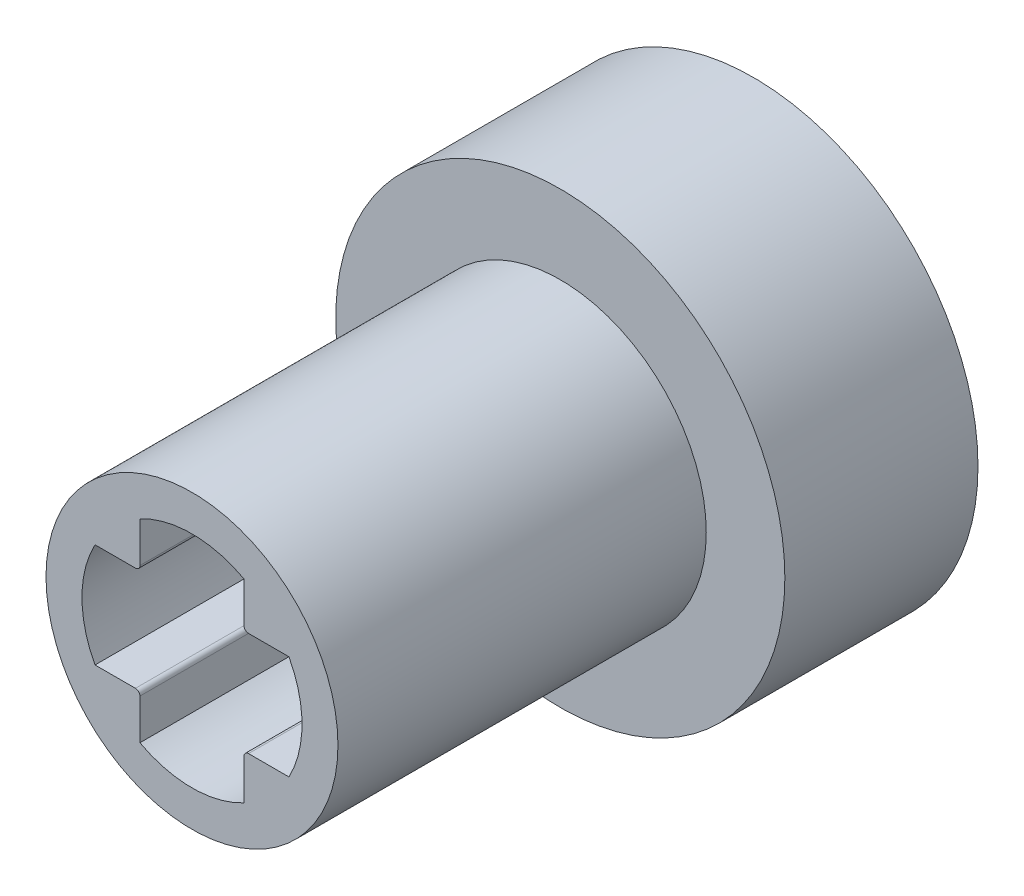
ISO-10303-21;
HEADER;
FILE_DESCRIPTION(('STEP AP214'),'2;1');
FILE_NAME('part.step','',(''),(''),'','','');
FILE_SCHEMA(('AUTOMOTIVE_DESIGN { 1 0 10303 214 1 1 1 1 }'));
ENDSEC;
DATA;
#1=APPLICATION_CONTEXT('core data for automotive mechanical design processes');
#2=APPLICATION_PROTOCOL_DEFINITION('international standard','automotive_design',2000,#1);
#3=PRODUCT_CONTEXT('',#1,'mechanical');
#4=PRODUCT('Part','Part','',(#3));
#5=PRODUCT_RELATED_PRODUCT_CATEGORY('part','',(#4));
#6=PRODUCT_DEFINITION_FORMATION('','',#4);
#7=PRODUCT_DEFINITION_CONTEXT('part definition',#1,'design');
#8=PRODUCT_DEFINITION('design','',#6,#7);
#9=PRODUCT_DEFINITION_SHAPE('','',#8);
#10=(LENGTH_UNIT() NAMED_UNIT(*) SI_UNIT(.MILLI.,.METRE.));
#11=(NAMED_UNIT(*) PLANE_ANGLE_UNIT() SI_UNIT($,.RADIAN.));
#12=(NAMED_UNIT(*) SI_UNIT($,.STERADIAN.) SOLID_ANGLE_UNIT());
#13=UNCERTAINTY_MEASURE_WITH_UNIT(LENGTH_MEASURE(1.E-05),#10,'distance_accuracy_value','');
#14=(GEOMETRIC_REPRESENTATION_CONTEXT(3) GLOBAL_UNCERTAINTY_ASSIGNED_CONTEXT((#13)) GLOBAL_UNIT_ASSIGNED_CONTEXT((#10,
#11,#12)) REPRESENTATION_CONTEXT('',''));
#15=CARTESIAN_POINT('',(0.,0.,0.));
#16=DIRECTION('',(0.,0.,1.));
#17=DIRECTION('',(1.,0.,0.));
#18=AXIS2_PLACEMENT_3D('',#15,#16,#17);
#19=CARTESIAN_POINT('',(0.,0.,12.5));
#20=DIRECTION('',(0.,0.,-1.));
#21=DIRECTION('',(-1.,0.,0.));
#22=AXIS2_PLACEMENT_3D('',#19,#20,#21);
#23=CYLINDRICAL_SURFACE('',#22,1.15);
#24=CARTESIAN_POINT('',(0.,0.,0.));
#25=DIRECTION('',(0.,0.,1.));
#26=DIRECTION('',(1.,0.,0.));
#27=AXIS2_PLACEMENT_3D('',#24,#25,#26);
#28=CIRCLE('',#27,1.15);
#29=CARTESIAN_POINT('',(1.15,0.,0.));
#30=VERTEX_POINT('',#29);
#31=EDGE_CURVE('E292',#30,#30,#28,.T.);
#32=ORIENTED_EDGE('',*,*,#31,.F.);
#33=EDGE_LOOP('',(#32));
#34=FACE_BOUND('',#33,.T.);
#35=CARTESIAN_POINT('',(0.,0.,4.5));
#36=DIRECTION('',(0.,0.,1.));
#37=DIRECTION('',(1.,0.,0.));
#38=AXIS2_PLACEMENT_3D('',#35,#36,#37);
#39=CIRCLE('',#38,1.15);
#40=CARTESIAN_POINT('',(1.15,0.,4.5));
#41=VERTEX_POINT('',#40);
#42=EDGE_CURVE('E172',#41,#41,#39,.F.);
#43=ORIENTED_EDGE('',*,*,#42,.F.);
#44=EDGE_LOOP('',(#43));
#45=FACE_BOUND('',#44,.T.);
#46=ADVANCED_FACE('F45',(#34,#45),#23,.F.);
#47=CARTESIAN_POINT('',(0.,0.,12.5));
#48=DIRECTION('',(0.,0.,1.));
#49=DIRECTION('',(1.,0.,0.));
#50=AXIS2_PLACEMENT_3D('',#47,#48,#49);
#51=PLANE('',#50);
#52=DIRECTION('',(1.,0.,0.));
#53=VECTOR('',#52,1.);
#54=CARTESIAN_POINT('',(0.,-1.15868924153984,12.5));
#55=LINE('',#54,#53);
#56=CARTESIAN_POINT('',(1.25868924153984,-1.15868924153984,12.5));
#57=VERTEX_POINT('',#56);
#58=CARTESIAN_POINT('',(2.15868924153984,-1.15868924153984,12.5));
#59=VERTEX_POINT('',#58);
#60=EDGE_CURVE('E255',#57,#59,#55,.T.);
#61=ORIENTED_EDGE('',*,*,#60,.F.);
#62=CARTESIAN_POINT('',(1.25868924153984,-1.25868924153984,12.5));
#63=DIRECTION('',(0.,0.,1.));
#64=DIRECTION('',(1.,0.,0.));
#65=AXIS2_PLACEMENT_3D('',#62,#63,#64);
#66=CIRCLE('',#65,0.1);
#67=CARTESIAN_POINT('',(1.15868924153984,-1.25868924153984,12.5));
#68=VERTEX_POINT('',#67);
#69=EDGE_CURVE('E316',#57,#68,#66,.T.);
#70=ORIENTED_EDGE('',*,*,#69,.T.);
#71=DIRECTION('',(0.,1.,0.));
#72=VECTOR('',#71,1.);
#73=CARTESIAN_POINT('',(1.15868924153984,0.,12.5));
#74=LINE('',#73,#72);
#75=CARTESIAN_POINT('',(1.15868924153984,-2.15868924153984,12.5));
#76=VERTEX_POINT('',#75);
#77=EDGE_CURVE('E251',#76,#68,#74,.T.);
#78=ORIENTED_EDGE('',*,*,#77,.F.);
#79=CARTESIAN_POINT('',(0.,0.,12.5));
#80=DIRECTION('',(0.,0.,1.));
#81=DIRECTION('',(1.,0.,0.));
#82=AXIS2_PLACEMENT_3D('',#79,#80,#81);
#83=CIRCLE('',#82,2.45);
#84=CARTESIAN_POINT('',(-1.15868924153984,-2.15868924153984,12.5));
#85=VERTEX_POINT('',#84);
#86=EDGE_CURVE('E250',#85,#76,#83,.T.);
#87=ORIENTED_EDGE('',*,*,#86,.F.);
#88=DIRECTION('',(0.,1.,0.));
#89=VECTOR('',#88,1.);
#90=CARTESIAN_POINT('',(-1.15868924153984,0.,12.5));
#91=LINE('',#90,#89);
#92=CARTESIAN_POINT('',(-1.15868924153984,-1.25868924153984,12.5));
#93=VERTEX_POINT('',#92);
#94=EDGE_CURVE('E246',#85,#93,#91,.T.);
#95=ORIENTED_EDGE('',*,*,#94,.T.);
#96=CARTESIAN_POINT('',(-1.25868924153984,-1.25868924153984,12.5));
#97=DIRECTION('',(0.,0.,1.));
#98=DIRECTION('',(1.,0.,0.));
#99=AXIS2_PLACEMENT_3D('',#96,#97,#98);
#100=CIRCLE('',#99,0.1);
#101=CARTESIAN_POINT('',(-1.25868924153984,-1.15868924153984,12.5));
#102=VERTEX_POINT('',#101);
#103=EDGE_CURVE('E307',#93,#102,#100,.T.);
#104=ORIENTED_EDGE('',*,*,#103,.T.);
#105=DIRECTION('',(1.,0.,0.));
#106=VECTOR('',#105,1.);
#107=CARTESIAN_POINT('',(0.,-1.15868924153984,12.5));
#108=LINE('',#107,#106);
#109=CARTESIAN_POINT('',(-2.15868924153984,-1.15868924153984,12.5));
#110=VERTEX_POINT('',#109);
#111=EDGE_CURVE('E243',#110,#102,#108,.T.);
#112=ORIENTED_EDGE('',*,*,#111,.F.);
#113=CARTESIAN_POINT('',(-2.15868924153984,1.15868924153984,12.5));
#114=VERTEX_POINT('',#113);
#115=EDGE_CURVE('E236',#114,#110,#83,.T.);
#116=ORIENTED_EDGE('',*,*,#115,.F.);
#117=DIRECTION('',(1.,0.,0.));
#118=VECTOR('',#117,1.);
#119=CARTESIAN_POINT('',(0.,1.15868924153984,12.5));
#120=LINE('',#119,#118);
#121=CARTESIAN_POINT('',(-1.25868924153984,1.15868924153984,12.5));
#122=VERTEX_POINT('',#121);
#123=EDGE_CURVE('E239',#114,#122,#120,.T.);
#124=ORIENTED_EDGE('',*,*,#123,.T.);
#125=CARTESIAN_POINT('',(-1.25868924153984,1.25868924153984,12.5));
#126=DIRECTION('',(0.,0.,1.));
#127=DIRECTION('',(1.,0.,0.));
#128=AXIS2_PLACEMENT_3D('',#125,#126,#127);
#129=CIRCLE('',#128,0.1);
#130=CARTESIAN_POINT('',(-1.15868924153984,1.25868924153984,12.5));
#131=VERTEX_POINT('',#130);
#132=EDGE_CURVE('E310',#122,#131,#129,.T.);
#133=ORIENTED_EDGE('',*,*,#132,.T.);
#134=DIRECTION('',(0.,1.,0.));
#135=VECTOR('',#134,1.);
#136=CARTESIAN_POINT('',(-1.15868924153984,0.,12.5));
#137=LINE('',#136,#135);
#138=CARTESIAN_POINT('',(-1.15868924153984,2.15868924153984,12.5));
#139=VERTEX_POINT('',#138);
#140=EDGE_CURVE('E234',#131,#139,#137,.T.);
#141=ORIENTED_EDGE('',*,*,#140,.T.);
#142=CARTESIAN_POINT('',(1.15868924153984,2.15868924153984,12.5));
#143=VERTEX_POINT('',#142);
#144=EDGE_CURVE('E231',#143,#139,#83,.T.);
#145=ORIENTED_EDGE('',*,*,#144,.F.);
#146=DIRECTION('',(0.,1.,0.));
#147=VECTOR('',#146,1.);
#148=CARTESIAN_POINT('',(1.15868924153984,0.,12.5));
#149=LINE('',#148,#147);
#150=CARTESIAN_POINT('',(1.15868924153984,1.25868924153984,12.5));
#151=VERTEX_POINT('',#150);
#152=EDGE_CURVE('E178',#151,#143,#149,.T.);
#153=ORIENTED_EDGE('',*,*,#152,.F.);
#154=CARTESIAN_POINT('',(1.25868924153984,1.25868924153984,12.5));
#155=DIRECTION('',(0.,0.,1.));
#156=DIRECTION('',(1.,0.,0.));
#157=AXIS2_PLACEMENT_3D('',#154,#155,#156);
#158=CIRCLE('',#157,0.1);
#159=CARTESIAN_POINT('',(1.25868924153984,1.15868924153984,12.5));
#160=VERTEX_POINT('',#159);
#161=EDGE_CURVE('E313',#151,#160,#158,.T.);
#162=ORIENTED_EDGE('',*,*,#161,.T.);
#163=DIRECTION('',(1.,0.,0.));
#164=VECTOR('',#163,1.);
#165=CARTESIAN_POINT('',(0.,1.15868924153984,12.5));
#166=LINE('',#165,#164);
#167=CARTESIAN_POINT('',(2.15868924153984,1.15868924153984,12.5));
#168=VERTEX_POINT('',#167);
#169=EDGE_CURVE('E258',#160,#168,#166,.T.);
#170=ORIENTED_EDGE('',*,*,#169,.T.);
#171=EDGE_CURVE('E235',#59,#168,#83,.T.);
#172=ORIENTED_EDGE('',*,*,#171,.F.);
#173=EDGE_LOOP('',(#61,#70,#78,#87,#95,#104,#112,#116,#124,#133,#141,#145,#153,#162,#170,#172));
#174=FACE_BOUND('',#173,.T.);
#175=CARTESIAN_POINT('',(0.,0.,12.5));
#176=DIRECTION('',(0.,0.,1.));
#177=DIRECTION('',(1.,0.,0.));
#178=AXIS2_PLACEMENT_3D('',#175,#176,#177);
#179=CIRCLE('',#178,3.25);
#180=CARTESIAN_POINT('',(3.25,0.,12.5));
#181=VERTEX_POINT('',#180);
#182=EDGE_CURVE('E265',#181,#181,#179,.T.);
#183=ORIENTED_EDGE('',*,*,#182,.T.);
#184=EDGE_LOOP('',(#183));
#185=FACE_BOUND('',#184,.T.);
#186=ADVANCED_FACE('F356',(#174,#185),#51,.T.);
#187=CARTESIAN_POINT('',(0.,0.,12.5));
#188=DIRECTION('',(0.,0.,-1.));
#189=DIRECTION('',(-1.,0.,0.));
#190=AXIS2_PLACEMENT_3D('',#187,#188,#189);
#191=CYLINDRICAL_SURFACE('',#190,5.);
#192=CARTESIAN_POINT('',(0.,0.,0.));
#193=DIRECTION('',(0.,0.,1.));
#194=DIRECTION('',(1.,0.,0.));
#195=AXIS2_PLACEMENT_3D('',#192,#193,#194);
#196=CIRCLE('',#195,5.);
#197=CARTESIAN_POINT('',(5.,0.,0.));
#198=VERTEX_POINT('',#197);
#199=EDGE_CURVE('E299',#198,#198,#196,.T.);
#200=ORIENTED_EDGE('',*,*,#199,.T.);
#201=EDGE_LOOP('',(#200));
#202=FACE_BOUND('',#201,.T.);
#203=CARTESIAN_POINT('',(0.,0.,4.3));
#204=DIRECTION('',(0.,0.,1.));
#205=DIRECTION('',(1.,0.,0.));
#206=AXIS2_PLACEMENT_3D('',#203,#204,#205);
#207=CIRCLE('',#206,5.);
#208=CARTESIAN_POINT('',(5.,0.,4.3));
#209=VERTEX_POINT('',#208);
#210=EDGE_CURVE('E288',#209,#209,#207,.T.);
#211=ORIENTED_EDGE('',*,*,#210,.F.);
#212=EDGE_LOOP('',(#211));
#213=FACE_BOUND('',#212,.T.);
#214=ADVANCED_FACE('F385',(#202,#213),#191,.T.);
#215=CARTESIAN_POINT('',(0.,0.,0.));
#216=DIRECTION('',(0.,0.,1.));
#217=DIRECTION('',(1.,0.,0.));
#218=AXIS2_PLACEMENT_3D('',#215,#216,#217);
#219=PLANE('',#218);
#220=ORIENTED_EDGE('',*,*,#199,.F.);
#221=EDGE_LOOP('',(#220));
#222=FACE_BOUND('',#221,.T.);
#223=ORIENTED_EDGE('',*,*,#31,.T.);
#224=EDGE_LOOP('',(#223));
#225=FACE_BOUND('',#224,.T.);
#226=ADVANCED_FACE('F393',(#222,#225),#219,.F.);
#227=CARTESIAN_POINT('',(0.,0.,4.3));
#228=DIRECTION('',(0.,0.,1.));
#229=DIRECTION('',(1.,0.,0.));
#230=AXIS2_PLACEMENT_3D('',#227,#228,#229);
#231=CYLINDRICAL_SURFACE('',#230,3.25);
#232=CARTESIAN_POINT('',(0.,0.,4.3));
#233=DIRECTION('',(0.,0.,1.));
#234=DIRECTION('',(1.,0.,0.));
#235=AXIS2_PLACEMENT_3D('',#232,#233,#234);
#236=CIRCLE('',#235,3.25);
#237=CARTESIAN_POINT('',(3.25,0.,4.3));
#238=VERTEX_POINT('',#237);
#239=EDGE_CURVE('E284',#238,#238,#236,.T.);
#240=ORIENTED_EDGE('',*,*,#239,.T.);
#241=EDGE_LOOP('',(#240));
#242=FACE_BOUND('',#241,.T.);
#243=ORIENTED_EDGE('',*,*,#182,.F.);
#244=EDGE_LOOP('',(#243));
#245=FACE_BOUND('',#244,.T.);
#246=ADVANCED_FACE('F390',(#242,#245),#231,.T.);
#247=CARTESIAN_POINT('',(0.,0.,4.3));
#248=DIRECTION('',(0.,0.,1.));
#249=DIRECTION('',(1.,0.,0.));
#250=AXIS2_PLACEMENT_3D('',#247,#248,#249);
#251=PLANE('',#250);
#252=ORIENTED_EDGE('',*,*,#239,.F.);
#253=EDGE_LOOP('',(#252));
#254=FACE_BOUND('',#253,.T.);
#255=ORIENTED_EDGE('',*,*,#210,.T.);
#256=EDGE_LOOP('',(#255));
#257=FACE_BOUND('',#256,.T.);
#258=ADVANCED_FACE('F405',(#254,#257),#251,.T.);
#259=CARTESIAN_POINT('',(1.15868924153984,0.,4.5));
#260=DIRECTION('',(1.,0.,0.));
#261=DIRECTION('',(0.,0.,-1.));
#262=AXIS2_PLACEMENT_3D('',#259,#260,#261);
#263=PLANE('',#262);
#264=DIRECTION('',(0.,1.,0.));
#265=VECTOR('',#264,1.);
#266=CARTESIAN_POINT('',(1.15868924153984,0.,4.5));
#267=LINE('',#266,#265);
#268=CARTESIAN_POINT('',(1.15868924153984,1.25868924153984,4.5));
#269=VERTEX_POINT('',#268);
#270=CARTESIAN_POINT('',(1.15868924153984,2.15868924153984,4.5));
#271=VERTEX_POINT('',#270);
#272=EDGE_CURVE('E159',#269,#271,#267,.T.);
#273=ORIENTED_EDGE('',*,*,#272,.F.);
#274=DIRECTION('',(0.,0.,1.));
#275=VECTOR('',#274,1.);
#276=CARTESIAN_POINT('',(1.15868924153984,1.25868924153984,12.5));
#277=LINE('',#276,#275);
#278=EDGE_CURVE('E322',#269,#151,#277,.T.);
#279=ORIENTED_EDGE('',*,*,#278,.T.);
#280=ORIENTED_EDGE('',*,*,#152,.T.);
#281=DIRECTION('',(0.,0.,1.));
#282=VECTOR('',#281,1.);
#283=CARTESIAN_POINT('',(1.15868924153984,2.15868924153984,4.5));
#284=LINE('',#283,#282);
#285=EDGE_CURVE('E175',#271,#143,#284,.T.);
#286=ORIENTED_EDGE('',*,*,#285,.F.);
#287=EDGE_LOOP('',(#273,#279,#280,#286));
#288=FACE_BOUND('',#287,.T.);
#289=ADVANCED_FACE('F176',(#288),#263,.F.);
#290=CARTESIAN_POINT('',(0.,1.15868924153984,4.5));
#291=DIRECTION('',(0.,-1.,0.));
#292=DIRECTION('',(0.,0.,-1.));
#293=AXIS2_PLACEMENT_3D('',#290,#291,#292);
#294=PLANE('',#293);
#295=ORIENTED_EDGE('',*,*,#169,.F.);
#296=DIRECTION('',(0.,0.,1.));
#297=VECTOR('',#296,1.);
#298=CARTESIAN_POINT('',(1.25868924153984,1.15868924153984,4.5));
#299=LINE('',#298,#297);
#300=CARTESIAN_POINT('',(1.25868924153984,1.15868924153984,4.5));
#301=VERTEX_POINT('',#300);
#302=EDGE_CURVE('E325',#160,#301,#299,.F.);
#303=ORIENTED_EDGE('',*,*,#302,.T.);
#304=DIRECTION('',(1.,0.,0.));
#305=VECTOR('',#304,1.);
#306=CARTESIAN_POINT('',(0.,1.15868924153984,4.5));
#307=LINE('',#306,#305);
#308=CARTESIAN_POINT('',(2.15868924153984,1.15868924153984,4.5));
#309=VERTEX_POINT('',#308);
#310=EDGE_CURVE('E184',#301,#309,#307,.T.);
#311=ORIENTED_EDGE('',*,*,#310,.T.);
#312=DIRECTION('',(0.,0.,1.));
#313=VECTOR('',#312,1.);
#314=CARTESIAN_POINT('',(2.15868924153984,1.15868924153984,4.5));
#315=LINE('',#314,#313);
#316=EDGE_CURVE('E261',#309,#168,#315,.T.);
#317=ORIENTED_EDGE('',*,*,#316,.T.);
#318=EDGE_LOOP('',(#295,#303,#311,#317));
#319=FACE_BOUND('',#318,.T.);
#320=ADVANCED_FACE('F366',(#319),#294,.T.);
#321=CARTESIAN_POINT('',(0.,0.,4.5));
#322=DIRECTION('',(0.,0.,1.));
#323=DIRECTION('',(1.,0.,0.));
#324=AXIS2_PLACEMENT_3D('',#321,#322,#323);
#325=CYLINDRICAL_SURFACE('',#324,2.45);
#326=ORIENTED_EDGE('',*,*,#171,.T.);
#327=ORIENTED_EDGE('',*,*,#316,.F.);
#328=CARTESIAN_POINT('',(0.,0.,4.5));
#329=DIRECTION('',(0.,0.,1.));
#330=DIRECTION('',(1.,0.,0.));
#331=AXIS2_PLACEMENT_3D('',#328,#329,#330);
#332=CIRCLE('',#331,2.45);
#333=CARTESIAN_POINT('',(2.15868924153984,-1.15868924153984,4.5));
#334=VERTEX_POINT('',#333);
#335=EDGE_CURVE('E192',#334,#309,#332,.T.);
#336=ORIENTED_EDGE('',*,*,#335,.F.);
#337=DIRECTION('',(0.,0.,1.));
#338=VECTOR('',#337,1.);
#339=CARTESIAN_POINT('',(2.15868924153984,-1.15868924153984,4.5));
#340=LINE('',#339,#338);
#341=EDGE_CURVE('E266',#334,#59,#340,.T.);
#342=ORIENTED_EDGE('',*,*,#341,.T.);
#343=EDGE_LOOP('',(#326,#327,#336,#342));
#344=FACE_BOUND('',#343,.T.);
#345=ADVANCED_FACE('F435',(#344),#325,.F.);
#346=CARTESIAN_POINT('',(0.,-1.15868924153984,4.5));
#347=DIRECTION('',(0.,-1.,0.));
#348=DIRECTION('',(0.,0.,-1.));
#349=AXIS2_PLACEMENT_3D('',#346,#347,#348);
#350=PLANE('',#349);
#351=DIRECTION('',(1.,0.,0.));
#352=VECTOR('',#351,1.);
#353=CARTESIAN_POINT('',(0.,-1.15868924153984,4.5));
#354=LINE('',#353,#352);
#355=CARTESIAN_POINT('',(1.25868924153984,-1.15868924153984,4.5));
#356=VERTEX_POINT('',#355);
#357=EDGE_CURVE('E199',#356,#334,#354,.T.);
#358=ORIENTED_EDGE('',*,*,#357,.F.);
#359=DIRECTION('',(0.,0.,1.));
#360=VECTOR('',#359,1.);
#361=CARTESIAN_POINT('',(1.25868924153984,-1.15868924153984,4.5));
#362=LINE('',#361,#360);
#363=EDGE_CURVE('E303',#356,#57,#362,.T.);
#364=ORIENTED_EDGE('',*,*,#363,.T.);
#365=ORIENTED_EDGE('',*,*,#60,.T.);
#366=ORIENTED_EDGE('',*,*,#341,.F.);
#367=EDGE_LOOP('',(#358,#364,#365,#366));
#368=FACE_BOUND('',#367,.T.);
#369=ADVANCED_FACE('F431',(#368),#350,.F.);
#370=CARTESIAN_POINT('',(1.15868924153984,0.,4.5));
#371=DIRECTION('',(1.,0.,0.));
#372=DIRECTION('',(0.,0.,-1.));
#373=AXIS2_PLACEMENT_3D('',#370,#371,#372);
#374=PLANE('',#373);
#375=ORIENTED_EDGE('',*,*,#77,.T.);
#376=DIRECTION('',(0.,0.,1.));
#377=VECTOR('',#376,1.);
#378=CARTESIAN_POINT('',(1.15868924153984,-1.25868924153984,4.5));
#379=LINE('',#378,#377);
#380=CARTESIAN_POINT('',(1.15868924153984,-1.25868924153984,4.5));
#381=VERTEX_POINT('',#380);
#382=EDGE_CURVE('E319',#68,#381,#379,.F.);
#383=ORIENTED_EDGE('',*,*,#382,.T.);
#384=DIRECTION('',(0.,1.,0.));
#385=VECTOR('',#384,1.);
#386=CARTESIAN_POINT('',(1.15868924153984,0.,4.5));
#387=LINE('',#386,#385);
#388=CARTESIAN_POINT('',(1.15868924153984,-2.15868924153984,4.5));
#389=VERTEX_POINT('',#388);
#390=EDGE_CURVE('E214',#389,#381,#387,.T.);
#391=ORIENTED_EDGE('',*,*,#390,.F.);
#392=DIRECTION('',(0.,0.,1.));
#393=VECTOR('',#392,1.);
#394=CARTESIAN_POINT('',(1.15868924153984,-2.15868924153984,4.5));
#395=LINE('',#394,#393);
#396=EDGE_CURVE('E270',#389,#76,#395,.T.);
#397=ORIENTED_EDGE('',*,*,#396,.T.);
#398=EDGE_LOOP('',(#375,#383,#391,#397));
#399=FACE_BOUND('',#398,.T.);
#400=ADVANCED_FACE('F428',(#399),#374,.F.);
#401=ORIENTED_EDGE('',*,*,#86,.T.);
#402=ORIENTED_EDGE('',*,*,#396,.F.);
#403=CARTESIAN_POINT('',(-1.15868924153984,-2.15868924153984,4.5));
#404=VERTEX_POINT('',#403);
#405=EDGE_CURVE('E200',#404,#389,#332,.T.);
#406=ORIENTED_EDGE('',*,*,#405,.F.);
#407=DIRECTION('',(0.,0.,1.));
#408=VECTOR('',#407,1.);
#409=CARTESIAN_POINT('',(-1.15868924153984,-2.15868924153984,4.5));
#410=LINE('',#409,#408);
#411=EDGE_CURVE('E273',#404,#85,#410,.T.);
#412=ORIENTED_EDGE('',*,*,#411,.T.);
#413=EDGE_LOOP('',(#401,#402,#406,#412));
#414=FACE_BOUND('',#413,.T.);
#415=ADVANCED_FACE('F427',(#414),#325,.F.);
#416=CARTESIAN_POINT('',(-1.15868924153984,0.,4.5));
#417=DIRECTION('',(1.,0.,0.));
#418=DIRECTION('',(0.,0.,-1.));
#419=AXIS2_PLACEMENT_3D('',#416,#417,#418);
#420=PLANE('',#419);
#421=DIRECTION('',(0.,1.,0.));
#422=VECTOR('',#421,1.);
#423=CARTESIAN_POINT('',(-1.15868924153984,0.,4.5));
#424=LINE('',#423,#422);
#425=CARTESIAN_POINT('',(-1.15868924153984,-1.25868924153984,4.5));
#426=VERTEX_POINT('',#425);
#427=EDGE_CURVE('E208',#404,#426,#424,.T.);
#428=ORIENTED_EDGE('',*,*,#427,.T.);
#429=DIRECTION('',(0.,0.,1.));
#430=VECTOR('',#429,1.);
#431=CARTESIAN_POINT('',(-1.15868924153984,-1.25868924153984,12.5));
#432=LINE('',#431,#430);
#433=EDGE_CURVE('E335',#426,#93,#432,.T.);
#434=ORIENTED_EDGE('',*,*,#433,.T.);
#435=ORIENTED_EDGE('',*,*,#94,.F.);
#436=ORIENTED_EDGE('',*,*,#411,.F.);
#437=EDGE_LOOP('',(#428,#434,#435,#436));
#438=FACE_BOUND('',#437,.T.);
#439=ADVANCED_FACE('F424',(#438),#420,.T.);
#440=CARTESIAN_POINT('',(0.,-1.15868924153984,4.5));
#441=DIRECTION('',(0.,-1.,0.));
#442=DIRECTION('',(0.,0.,-1.));
#443=AXIS2_PLACEMENT_3D('',#440,#441,#442);
#444=PLANE('',#443);
#445=ORIENTED_EDGE('',*,*,#111,.T.);
#446=DIRECTION('',(0.,0.,1.));
#447=VECTOR('',#446,1.);
#448=CARTESIAN_POINT('',(-1.25868924153984,-1.15868924153984,4.5));
#449=LINE('',#448,#447);
#450=CARTESIAN_POINT('',(-1.25868924153984,-1.15868924153984,4.5));
#451=VERTEX_POINT('',#450);
#452=EDGE_CURVE('E61',#102,#451,#449,.F.);
#453=ORIENTED_EDGE('',*,*,#452,.T.);
#454=DIRECTION('',(1.,0.,0.));
#455=VECTOR('',#454,1.);
#456=CARTESIAN_POINT('',(0.,-1.15868924153984,4.5));
#457=LINE('',#456,#455);
#458=CARTESIAN_POINT('',(-2.15868924153984,-1.15868924153984,4.5));
#459=VERTEX_POINT('',#458);
#460=EDGE_CURVE('E203',#459,#451,#457,.T.);
#461=ORIENTED_EDGE('',*,*,#460,.F.);
#462=DIRECTION('',(0.,0.,1.));
#463=VECTOR('',#462,1.);
#464=CARTESIAN_POINT('',(-2.15868924153984,-1.15868924153984,4.5));
#465=LINE('',#464,#463);
#466=EDGE_CURVE('E276',#459,#110,#465,.T.);
#467=ORIENTED_EDGE('',*,*,#466,.T.);
#468=EDGE_LOOP('',(#445,#453,#461,#467));
#469=FACE_BOUND('',#468,.T.);
#470=ADVANCED_FACE('F421',(#469),#444,.F.);
#471=ORIENTED_EDGE('',*,*,#115,.T.);
#472=ORIENTED_EDGE('',*,*,#466,.F.);
#473=CARTESIAN_POINT('',(-2.15868924153984,1.15868924153984,4.5));
#474=VERTEX_POINT('',#473);
#475=EDGE_CURVE('E193',#474,#459,#332,.T.);
#476=ORIENTED_EDGE('',*,*,#475,.F.);
#477=DIRECTION('',(0.,0.,1.));
#478=VECTOR('',#477,1.);
#479=CARTESIAN_POINT('',(-2.15868924153984,1.15868924153984,4.5));
#480=LINE('',#479,#478);
#481=EDGE_CURVE('E279',#474,#114,#480,.T.);
#482=ORIENTED_EDGE('',*,*,#481,.T.);
#483=EDGE_LOOP('',(#471,#472,#476,#482));
#484=FACE_BOUND('',#483,.T.);
#485=ADVANCED_FACE('F420',(#484),#325,.F.);
#486=CARTESIAN_POINT('',(0.,1.15868924153984,4.5));
#487=DIRECTION('',(0.,-1.,0.));
#488=DIRECTION('',(0.,0.,-1.));
#489=AXIS2_PLACEMENT_3D('',#486,#487,#488);
#490=PLANE('',#489);
#491=DIRECTION('',(1.,0.,0.));
#492=VECTOR('',#491,1.);
#493=CARTESIAN_POINT('',(0.,1.15868924153984,4.5));
#494=LINE('',#493,#492);
#495=CARTESIAN_POINT('',(-1.25868924153984,1.15868924153984,4.5));
#496=VERTEX_POINT('',#495);
#497=EDGE_CURVE('E195',#474,#496,#494,.T.);
#498=ORIENTED_EDGE('',*,*,#497,.T.);
#499=DIRECTION('',(0.,0.,1.));
#500=VECTOR('',#499,1.);
#501=CARTESIAN_POINT('',(-1.25868924153984,1.15868924153984,4.5));
#502=LINE('',#501,#500);
#503=EDGE_CURVE('E328',#496,#122,#502,.T.);
#504=ORIENTED_EDGE('',*,*,#503,.T.);
#505=ORIENTED_EDGE('',*,*,#123,.F.);
#506=ORIENTED_EDGE('',*,*,#481,.F.);
#507=EDGE_LOOP('',(#498,#504,#505,#506));
#508=FACE_BOUND('',#507,.T.);
#509=ADVANCED_FACE('F350',(#508),#490,.T.);
#510=CARTESIAN_POINT('',(-1.15868924153984,0.,4.5));
#511=DIRECTION('',(1.,0.,0.));
#512=DIRECTION('',(0.,0.,-1.));
#513=AXIS2_PLACEMENT_3D('',#510,#511,#512);
#514=PLANE('',#513);
#515=ORIENTED_EDGE('',*,*,#140,.F.);
#516=DIRECTION('',(0.,0.,1.));
#517=VECTOR('',#516,1.);
#518=CARTESIAN_POINT('',(-1.15868924153984,1.25868924153984,4.5));
#519=LINE('',#518,#517);
#520=CARTESIAN_POINT('',(-1.15868924153984,1.25868924153984,4.5));
#521=VERTEX_POINT('',#520);
#522=EDGE_CURVE('E332',#131,#521,#519,.F.);
#523=ORIENTED_EDGE('',*,*,#522,.T.);
#524=DIRECTION('',(0.,1.,0.));
#525=VECTOR('',#524,1.);
#526=CARTESIAN_POINT('',(-1.15868924153984,0.,4.5));
#527=LINE('',#526,#525);
#528=CARTESIAN_POINT('',(-1.15868924153984,2.15868924153984,4.5));
#529=VERTEX_POINT('',#528);
#530=EDGE_CURVE('E190',#521,#529,#527,.T.);
#531=ORIENTED_EDGE('',*,*,#530,.T.);
#532=DIRECTION('',(0.,0.,1.));
#533=VECTOR('',#532,1.);
#534=CARTESIAN_POINT('',(-1.15868924153984,2.15868924153984,4.5));
#535=LINE('',#534,#533);
#536=EDGE_CURVE('E183',#529,#139,#535,.T.);
#537=ORIENTED_EDGE('',*,*,#536,.T.);
#538=EDGE_LOOP('',(#515,#523,#531,#537));
#539=FACE_BOUND('',#538,.T.);
#540=ADVANCED_FACE('F360',(#539),#514,.T.);
#541=ORIENTED_EDGE('',*,*,#144,.T.);
#542=ORIENTED_EDGE('',*,*,#536,.F.);
#543=EDGE_CURVE('E165',#271,#529,#332,.T.);
#544=ORIENTED_EDGE('',*,*,#543,.F.);
#545=ORIENTED_EDGE('',*,*,#285,.T.);
#546=EDGE_LOOP('',(#541,#542,#544,#545));
#547=FACE_BOUND('',#546,.T.);
#548=ADVANCED_FACE('F187',(#547),#325,.F.);
#549=CARTESIAN_POINT('',(0.,0.,4.5));
#550=DIRECTION('',(0.,0.,1.));
#551=DIRECTION('',(1.,0.,0.));
#552=AXIS2_PLACEMENT_3D('',#549,#550,#551);
#553=PLANE('',#552);
#554=ORIENTED_EDGE('',*,*,#42,.T.);
#555=EDGE_LOOP('',(#554));
#556=FACE_BOUND('',#555,.T.);
#557=ORIENTED_EDGE('',*,*,#310,.F.);
#558=CARTESIAN_POINT('',(1.25868924153984,1.25868924153984,4.5));
#559=DIRECTION('',(0.,0.,1.));
#560=DIRECTION('',(1.,0.,0.));
#561=AXIS2_PLACEMENT_3D('',#558,#559,#560);
#562=CIRCLE('',#561,0.1);
#563=EDGE_CURVE('E167',#301,#269,#562,.F.);
#564=ORIENTED_EDGE('',*,*,#563,.T.);
#565=ORIENTED_EDGE('',*,*,#272,.T.);
#566=ORIENTED_EDGE('',*,*,#543,.T.);
#567=ORIENTED_EDGE('',*,*,#530,.F.);
#568=CARTESIAN_POINT('',(-1.25868924153984,1.25868924153984,4.5));
#569=DIRECTION('',(0.,0.,1.));
#570=DIRECTION('',(1.,0.,0.));
#571=AXIS2_PLACEMENT_3D('',#568,#569,#570);
#572=CIRCLE('',#571,0.1);
#573=EDGE_CURVE('E54',#521,#496,#572,.F.);
#574=ORIENTED_EDGE('',*,*,#573,.T.);
#575=ORIENTED_EDGE('',*,*,#497,.F.);
#576=ORIENTED_EDGE('',*,*,#475,.T.);
#577=ORIENTED_EDGE('',*,*,#460,.T.);
#578=CARTESIAN_POINT('',(-1.25868924153984,-1.25868924153984,4.5));
#579=DIRECTION('',(0.,0.,1.));
#580=DIRECTION('',(1.,0.,0.));
#581=AXIS2_PLACEMENT_3D('',#578,#579,#580);
#582=CIRCLE('',#581,0.1);
#583=EDGE_CURVE('E11',#451,#426,#582,.F.);
#584=ORIENTED_EDGE('',*,*,#583,.T.);
#585=ORIENTED_EDGE('',*,*,#427,.F.);
#586=ORIENTED_EDGE('',*,*,#405,.T.);
#587=ORIENTED_EDGE('',*,*,#390,.T.);
#588=CARTESIAN_POINT('',(1.25868924153984,-1.25868924153984,4.5));
#589=DIRECTION('',(0.,0.,1.));
#590=DIRECTION('',(1.,0.,0.));
#591=AXIS2_PLACEMENT_3D('',#588,#589,#590);
#592=CIRCLE('',#591,0.1);
#593=EDGE_CURVE('E340',#381,#356,#592,.F.);
#594=ORIENTED_EDGE('',*,*,#593,.T.);
#595=ORIENTED_EDGE('',*,*,#357,.T.);
#596=ORIENTED_EDGE('',*,*,#335,.T.);
#597=EDGE_LOOP('',(#557,#564,#565,#566,#567,#574,#575,#576,#577,#584,#585,#586,#587,#594,#595,#596));
#598=FACE_BOUND('',#597,.T.);
#599=ADVANCED_FACE('F162',(#556,#598),#553,.T.);
#600=CARTESIAN_POINT('',(1.25868924153984,-1.25868924153984,4.5));
#601=DIRECTION('',(0.,0.,1.));
#602=DIRECTION('',(1.,0.,0.));
#603=AXIS2_PLACEMENT_3D('',#600,#601,#602);
#604=CYLINDRICAL_SURFACE('',#603,0.1);
#605=ORIENTED_EDGE('',*,*,#593,.F.);
#606=ORIENTED_EDGE('',*,*,#382,.F.);
#607=ORIENTED_EDGE('',*,*,#69,.F.);
#608=ORIENTED_EDGE('',*,*,#363,.F.);
#609=EDGE_LOOP('',(#605,#606,#607,#608));
#610=FACE_BOUND('',#609,.T.);
#611=ADVANCED_FACE('F371',(#610),#604,.T.);
#612=CARTESIAN_POINT('',(1.25868924153984,1.25868924153984,4.5));
#613=DIRECTION('',(0.,0.,-1.));
#614=DIRECTION('',(-1.,0.,0.));
#615=AXIS2_PLACEMENT_3D('',#612,#613,#614);
#616=CYLINDRICAL_SURFACE('',#615,0.1);
#617=ORIENTED_EDGE('',*,*,#563,.F.);
#618=ORIENTED_EDGE('',*,*,#302,.F.);
#619=ORIENTED_EDGE('',*,*,#161,.F.);
#620=ORIENTED_EDGE('',*,*,#278,.F.);
#621=EDGE_LOOP('',(#617,#618,#619,#620));
#622=FACE_BOUND('',#621,.T.);
#623=ADVANCED_FACE('F369',(#622),#616,.T.);
#624=CARTESIAN_POINT('',(-1.25868924153984,1.25868924153984,4.5));
#625=DIRECTION('',(0.,0.,1.));
#626=DIRECTION('',(1.,0.,0.));
#627=AXIS2_PLACEMENT_3D('',#624,#625,#626);
#628=CYLINDRICAL_SURFACE('',#627,0.1);
#629=ORIENTED_EDGE('',*,*,#573,.F.);
#630=ORIENTED_EDGE('',*,*,#522,.F.);
#631=ORIENTED_EDGE('',*,*,#132,.F.);
#632=ORIENTED_EDGE('',*,*,#503,.F.);
#633=EDGE_LOOP('',(#629,#630,#631,#632));
#634=FACE_BOUND('',#633,.T.);
#635=ADVANCED_FACE('F352',(#634),#628,.T.);
#636=CARTESIAN_POINT('',(-1.25868924153984,-1.25868924153984,4.5));
#637=DIRECTION('',(0.,0.,-1.));
#638=DIRECTION('',(-1.,0.,0.));
#639=AXIS2_PLACEMENT_3D('',#636,#637,#638);
#640=CYLINDRICAL_SURFACE('',#639,0.1);
#641=ORIENTED_EDGE('',*,*,#583,.F.);
#642=ORIENTED_EDGE('',*,*,#452,.F.);
#643=ORIENTED_EDGE('',*,*,#103,.F.);
#644=ORIENTED_EDGE('',*,*,#433,.F.);
#645=EDGE_LOOP('',(#641,#642,#643,#644));
#646=FACE_BOUND('',#645,.T.);
#647=ADVANCED_FACE('F47',(#646),#640,.T.);
#648=CLOSED_SHELL('',(#46,#186,#214,#226,#246,#258,#289,#320,#345,#369,#400,#415,#439,#470,#485,
#509,#540,#548,#599,#611,#623,#635,#647));
#649=MANIFOLD_SOLID_BREP('B2',#648);
#650=ADVANCED_BREP_SHAPE_REPRESENTATION('',(#18,#649),#14);
#651=SHAPE_DEFINITION_REPRESENTATION(#9,#650);
ENDSEC;
END-ISO-10303-21;
